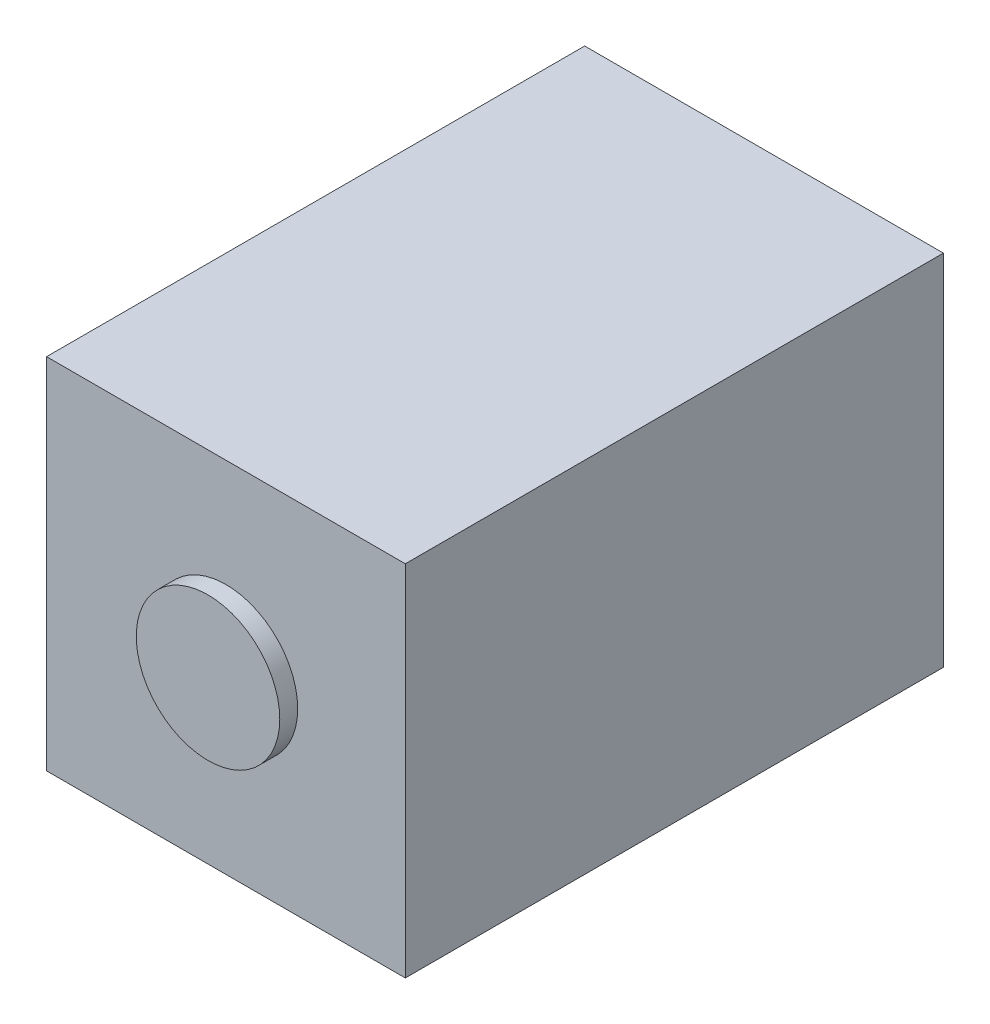
ISO-10303-21;
HEADER;
FILE_DESCRIPTION(('STEP AP214'),'2;1');
FILE_NAME('part.step','',(''),(''),'','','');
FILE_SCHEMA(('AUTOMOTIVE_DESIGN { 1 0 10303 214 1 1 1 1 }'));
ENDSEC;
DATA;
#1=APPLICATION_CONTEXT('core data for automotive mechanical design processes');
#2=APPLICATION_PROTOCOL_DEFINITION('international standard','automotive_design',2000,#1);
#3=PRODUCT_CONTEXT('',#1,'mechanical');
#4=PRODUCT('Part','Part','',(#3));
#5=PRODUCT_RELATED_PRODUCT_CATEGORY('part','',(#4));
#6=PRODUCT_DEFINITION_FORMATION('','',#4);
#7=PRODUCT_DEFINITION_CONTEXT('part definition',#1,'design');
#8=PRODUCT_DEFINITION('design','',#6,#7);
#9=PRODUCT_DEFINITION_SHAPE('','',#8);
#10=(LENGTH_UNIT() NAMED_UNIT(*) SI_UNIT(.MILLI.,.METRE.));
#11=(NAMED_UNIT(*) PLANE_ANGLE_UNIT() SI_UNIT($,.RADIAN.));
#12=(NAMED_UNIT(*) SI_UNIT($,.STERADIAN.) SOLID_ANGLE_UNIT());
#13=UNCERTAINTY_MEASURE_WITH_UNIT(LENGTH_MEASURE(1.E-05),#10,'distance_accuracy_value','');
#14=(GEOMETRIC_REPRESENTATION_CONTEXT(3) GLOBAL_UNCERTAINTY_ASSIGNED_CONTEXT((#13)) GLOBAL_UNIT_ASSIGNED_CONTEXT((#10,
#11,#12)) REPRESENTATION_CONTEXT('',''));
#15=CARTESIAN_POINT('',(0.,0.,0.));
#16=DIRECTION('',(0.,0.,1.));
#17=DIRECTION('',(1.,0.,0.));
#18=AXIS2_PLACEMENT_3D('',#15,#16,#17);
#19=CARTESIAN_POINT('',(100.,-100.,150.));
#20=DIRECTION('',(-1.,0.,0.));
#21=DIRECTION('',(0.,0.,1.));
#22=AXIS2_PLACEMENT_3D('',#19,#20,#21);
#23=PLANE('',#22);
#24=DIRECTION('',(0.,1.,0.));
#25=VECTOR('',#24,1.);
#26=CARTESIAN_POINT('',(100.,-100.,-150.));
#27=LINE('',#26,#25);
#28=CARTESIAN_POINT('',(100.,-100.,-150.));
#29=VERTEX_POINT('',#28);
#30=CARTESIAN_POINT('',(100.,100.,-150.));
#31=VERTEX_POINT('',#30);
#32=EDGE_CURVE('E107',#29,#31,#27,.T.);
#33=ORIENTED_EDGE('',*,*,#32,.T.);
#34=DIRECTION('',(0.,0.,-1.));
#35=VECTOR('',#34,1.);
#36=CARTESIAN_POINT('',(100.,100.,150.));
#37=LINE('',#36,#35);
#38=CARTESIAN_POINT('',(100.,100.,150.));
#39=VERTEX_POINT('',#38);
#40=EDGE_CURVE('E43',#39,#31,#37,.T.);
#41=ORIENTED_EDGE('',*,*,#40,.F.);
#42=DIRECTION('',(0.,1.,0.));
#43=VECTOR('',#42,1.);
#44=CARTESIAN_POINT('',(100.,-100.,150.));
#45=LINE('',#44,#43);
#46=CARTESIAN_POINT('',(100.,-100.,150.));
#47=VERTEX_POINT('',#46);
#48=EDGE_CURVE('E94',#47,#39,#45,.T.);
#49=ORIENTED_EDGE('',*,*,#48,.F.);
#50=DIRECTION('',(0.,0.,-1.));
#51=VECTOR('',#50,1.);
#52=CARTESIAN_POINT('',(100.,-100.,150.));
#53=LINE('',#52,#51);
#54=EDGE_CURVE('E103',#47,#29,#53,.T.);
#55=ORIENTED_EDGE('',*,*,#54,.T.);
#56=EDGE_LOOP('',(#33,#41,#49,#55));
#57=FACE_BOUND('',#56,.T.);
#58=ADVANCED_FACE('F40',(#57),#23,.F.);
#59=CARTESIAN_POINT('',(-100.,100.,150.));
#60=DIRECTION('',(0.,-1.,0.));
#61=DIRECTION('',(0.,0.,-1.));
#62=AXIS2_PLACEMENT_3D('',#59,#60,#61);
#63=PLANE('',#62);
#64=DIRECTION('',(-1.,0.,0.));
#65=VECTOR('',#64,1.);
#66=CARTESIAN_POINT('',(-100.,100.,-150.));
#67=LINE('',#66,#65);
#68=CARTESIAN_POINT('',(-100.,100.,-150.));
#69=VERTEX_POINT('',#68);
#70=EDGE_CURVE('E99',#31,#69,#67,.T.);
#71=ORIENTED_EDGE('',*,*,#70,.T.);
#72=DIRECTION('',(0.,0.,-1.));
#73=VECTOR('',#72,1.);
#74=CARTESIAN_POINT('',(-100.,100.,150.));
#75=LINE('',#74,#73);
#76=CARTESIAN_POINT('',(-100.,100.,150.));
#77=VERTEX_POINT('',#76);
#78=EDGE_CURVE('E97',#77,#69,#75,.T.);
#79=ORIENTED_EDGE('',*,*,#78,.F.);
#80=DIRECTION('',(-1.,0.,0.));
#81=VECTOR('',#80,1.);
#82=CARTESIAN_POINT('',(-100.,100.,150.));
#83=LINE('',#82,#81);
#84=EDGE_CURVE('E89',#39,#77,#83,.T.);
#85=ORIENTED_EDGE('',*,*,#84,.F.);
#86=ORIENTED_EDGE('',*,*,#40,.T.);
#87=EDGE_LOOP('',(#71,#79,#85,#86));
#88=FACE_BOUND('',#87,.T.);
#89=ADVANCED_FACE('F98',(#88),#63,.F.);
#90=CARTESIAN_POINT('',(-100.,-100.,150.));
#91=DIRECTION('',(1.,0.,0.));
#92=DIRECTION('',(0.,0.,-1.));
#93=AXIS2_PLACEMENT_3D('',#90,#91,#92);
#94=PLANE('',#93);
#95=DIRECTION('',(0.,-1.,0.));
#96=VECTOR('',#95,1.);
#97=CARTESIAN_POINT('',(-100.,-100.,-150.));
#98=LINE('',#97,#96);
#99=CARTESIAN_POINT('',(-100.,-100.,-150.));
#100=VERTEX_POINT('',#99);
#101=EDGE_CURVE('E75',#69,#100,#98,.T.);
#102=ORIENTED_EDGE('',*,*,#101,.T.);
#103=DIRECTION('',(0.,0.,-1.));
#104=VECTOR('',#103,1.);
#105=CARTESIAN_POINT('',(-100.,-100.,150.));
#106=LINE('',#105,#104);
#107=CARTESIAN_POINT('',(-100.,-100.,150.));
#108=VERTEX_POINT('',#107);
#109=EDGE_CURVE('E100',#108,#100,#106,.T.);
#110=ORIENTED_EDGE('',*,*,#109,.F.);
#111=DIRECTION('',(0.,-1.,0.));
#112=VECTOR('',#111,1.);
#113=CARTESIAN_POINT('',(-100.,-100.,150.));
#114=LINE('',#113,#112);
#115=EDGE_CURVE('E92',#77,#108,#114,.T.);
#116=ORIENTED_EDGE('',*,*,#115,.F.);
#117=ORIENTED_EDGE('',*,*,#78,.T.);
#118=EDGE_LOOP('',(#102,#110,#116,#117));
#119=FACE_BOUND('',#118,.T.);
#120=ADVANCED_FACE('F101',(#119),#94,.F.);
#121=CARTESIAN_POINT('',(-100.,-100.,150.));
#122=DIRECTION('',(0.,1.,0.));
#123=DIRECTION('',(0.,0.,1.));
#124=AXIS2_PLACEMENT_3D('',#121,#122,#123);
#125=PLANE('',#124);
#126=DIRECTION('',(1.,0.,0.));
#127=VECTOR('',#126,1.);
#128=CARTESIAN_POINT('',(-100.,-100.,-150.));
#129=LINE('',#128,#127);
#130=EDGE_CURVE('E81',#100,#29,#129,.T.);
#131=ORIENTED_EDGE('',*,*,#130,.T.);
#132=ORIENTED_EDGE('',*,*,#54,.F.);
#133=DIRECTION('',(1.,0.,0.));
#134=VECTOR('',#133,1.);
#135=CARTESIAN_POINT('',(-100.,-100.,150.));
#136=LINE('',#135,#134);
#137=EDGE_CURVE('E58',#108,#47,#136,.T.);
#138=ORIENTED_EDGE('',*,*,#137,.F.);
#139=ORIENTED_EDGE('',*,*,#109,.T.);
#140=EDGE_LOOP('',(#131,#132,#138,#139));
#141=FACE_BOUND('',#140,.T.);
#142=ADVANCED_FACE('F115',(#141),#125,.F.);
#143=CARTESIAN_POINT('',(0.,0.,150.));
#144=DIRECTION('',(0.,0.,-1.));
#145=DIRECTION('',(-1.,0.,0.));
#146=AXIS2_PLACEMENT_3D('',#143,#144,#145);
#147=PLANE('',#146);
#148=CARTESIAN_POINT('',(0.,0.,150.));
#149=DIRECTION('',(0.,0.,1.));
#150=DIRECTION('',(1.,0.,0.));
#151=AXIS2_PLACEMENT_3D('',#148,#149,#150);
#152=CIRCLE('',#151,40.);
#153=CARTESIAN_POINT('',(40.,0.,150.));
#154=VERTEX_POINT('',#153);
#155=EDGE_CURVE('E49',#154,#154,#152,.T.);
#156=ORIENTED_EDGE('',*,*,#155,.F.);
#157=EDGE_LOOP('',(#156));
#158=FACE_BOUND('',#157,.T.);
#159=ORIENTED_EDGE('',*,*,#48,.T.);
#160=ORIENTED_EDGE('',*,*,#84,.T.);
#161=ORIENTED_EDGE('',*,*,#115,.T.);
#162=ORIENTED_EDGE('',*,*,#137,.T.);
#163=EDGE_LOOP('',(#159,#160,#161,#162));
#164=FACE_BOUND('',#163,.T.);
#165=ADVANCED_FACE('F90',(#158,#164),#147,.F.);
#166=CARTESIAN_POINT('',(0.,0.,-150.));
#167=DIRECTION('',(0.,0.,-1.));
#168=DIRECTION('',(-1.,0.,0.));
#169=AXIS2_PLACEMENT_3D('',#166,#167,#168);
#170=PLANE('',#169);
#171=CARTESIAN_POINT('',(0.,0.,-150.));
#172=DIRECTION('',(0.,0.,-1.));
#173=DIRECTION('',(-1.,0.,0.));
#174=AXIS2_PLACEMENT_3D('',#171,#172,#173);
#175=CIRCLE('',#174,40.);
#176=CARTESIAN_POINT('',(-40.,0.,-150.));
#177=VERTEX_POINT('',#176);
#178=EDGE_CURVE('E11',#177,#177,#175,.T.);
#179=ORIENTED_EDGE('',*,*,#178,.F.);
#180=EDGE_LOOP('',(#179));
#181=FACE_BOUND('',#180,.T.);
#182=ORIENTED_EDGE('',*,*,#32,.F.);
#183=ORIENTED_EDGE('',*,*,#130,.F.);
#184=ORIENTED_EDGE('',*,*,#101,.F.);
#185=ORIENTED_EDGE('',*,*,#70,.F.);
#186=EDGE_LOOP('',(#182,#183,#184,#185));
#187=FACE_BOUND('',#186,.T.);
#188=ADVANCED_FACE('F118',(#181,#187),#170,.T.);
#189=CARTESIAN_POINT('',(0.,0.,160.));
#190=DIRECTION('',(0.,0.,-1.));
#191=DIRECTION('',(-1.,0.,0.));
#192=AXIS2_PLACEMENT_3D('',#189,#190,#191);
#193=CYLINDRICAL_SURFACE('',#192,40.);
#194=CARTESIAN_POINT('',(0.,0.,160.));
#195=DIRECTION('',(0.,0.,1.));
#196=DIRECTION('',(1.,0.,0.));
#197=AXIS2_PLACEMENT_3D('',#194,#195,#196);
#198=CIRCLE('',#197,40.);
#199=CARTESIAN_POINT('',(40.,0.,160.));
#200=VERTEX_POINT('',#199);
#201=EDGE_CURVE('E110',#200,#200,#198,.T.);
#202=ORIENTED_EDGE('',*,*,#201,.F.);
#203=EDGE_LOOP('',(#202));
#204=FACE_BOUND('',#203,.T.);
#205=ORIENTED_EDGE('',*,*,#155,.T.);
#206=EDGE_LOOP('',(#205));
#207=FACE_BOUND('',#206,.T.);
#208=ADVANCED_FACE('F139',(#204,#207),#193,.T.);
#209=CARTESIAN_POINT('',(0.,0.,160.));
#210=DIRECTION('',(0.,0.,1.));
#211=DIRECTION('',(1.,0.,0.));
#212=AXIS2_PLACEMENT_3D('',#209,#210,#211);
#213=PLANE('',#212);
#214=ORIENTED_EDGE('',*,*,#201,.T.);
#215=EDGE_LOOP('',(#214));
#216=FACE_BOUND('',#215,.T.);
#217=ADVANCED_FACE('F134',(#216),#213,.T.);
#218=CARTESIAN_POINT('',(0.,0.,-160.));
#219=DIRECTION('',(0.,0.,1.));
#220=DIRECTION('',(1.,0.,0.));
#221=AXIS2_PLACEMENT_3D('',#218,#219,#220);
#222=CYLINDRICAL_SURFACE('',#221,40.);
#223=CARTESIAN_POINT('',(0.,0.,-160.));
#224=DIRECTION('',(0.,0.,-1.));
#225=DIRECTION('',(-1.,0.,0.));
#226=AXIS2_PLACEMENT_3D('',#223,#224,#225);
#227=CIRCLE('',#226,40.);
#228=CARTESIAN_POINT('',(-40.,0.,-160.));
#229=VERTEX_POINT('',#228);
#230=EDGE_CURVE('E124',#229,#229,#227,.T.);
#231=ORIENTED_EDGE('',*,*,#230,.F.);
#232=EDGE_LOOP('',(#231));
#233=FACE_BOUND('',#232,.T.);
#234=ORIENTED_EDGE('',*,*,#178,.T.);
#235=EDGE_LOOP('',(#234));
#236=FACE_BOUND('',#235,.T.);
#237=ADVANCED_FACE('F131',(#233,#236),#222,.T.);
#238=CARTESIAN_POINT('',(0.,0.,-160.));
#239=DIRECTION('',(0.,0.,-1.));
#240=DIRECTION('',(-1.,0.,0.));
#241=AXIS2_PLACEMENT_3D('',#238,#239,#240);
#242=PLANE('',#241);
#243=ORIENTED_EDGE('',*,*,#230,.T.);
#244=EDGE_LOOP('',(#243));
#245=FACE_BOUND('',#244,.T.);
#246=ADVANCED_FACE('F129',(#245),#242,.T.);
#247=CLOSED_SHELL('',(#58,#89,#120,#142,#165,#188,#208,#217,#237,#246));
#248=MANIFOLD_SOLID_BREP('B2',#247);
#249=ADVANCED_BREP_SHAPE_REPRESENTATION('',(#18,#248),#14);
#250=SHAPE_DEFINITION_REPRESENTATION(#9,#249);
ENDSEC;
END-ISO-10303-21;
